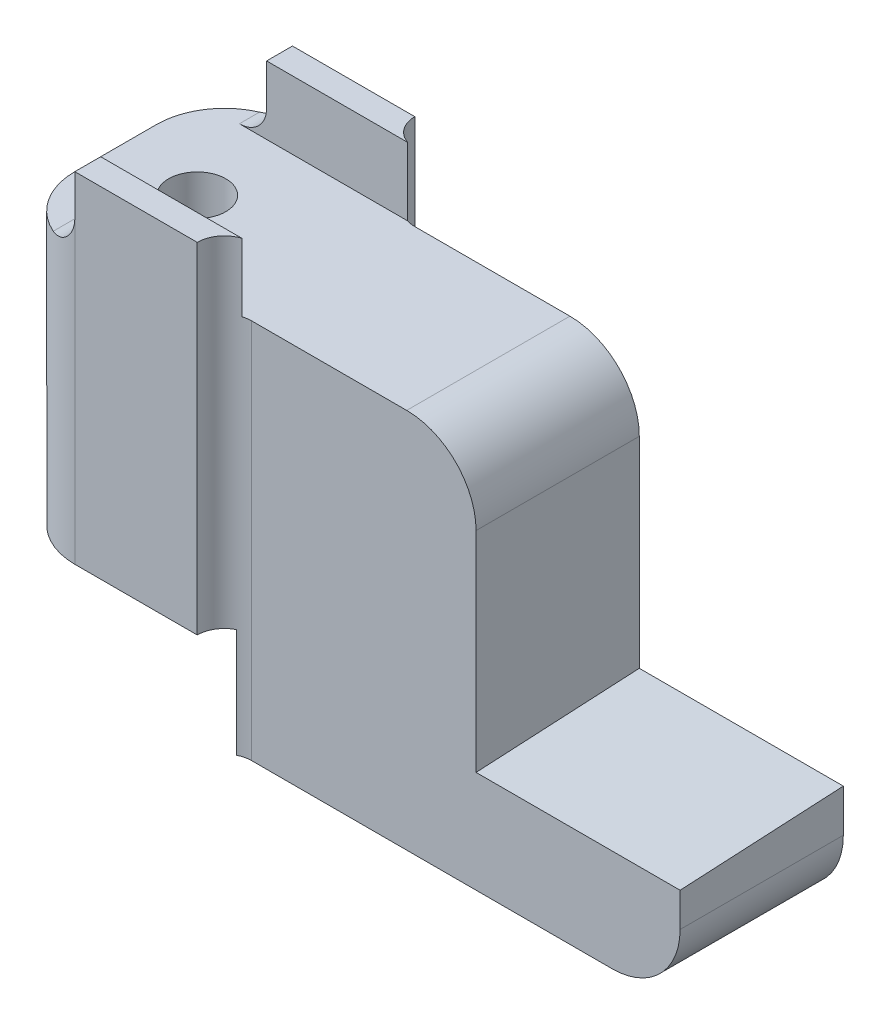
ISO-10303-21;
HEADER;
FILE_DESCRIPTION(('STEP AP214'),'2;1');
FILE_NAME('part.step','',(''),(''),'','','');
FILE_SCHEMA(('AUTOMOTIVE_DESIGN { 1 0 10303 214 1 1 1 1 }'));
ENDSEC;
DATA;
#1=APPLICATION_CONTEXT('core data for automotive mechanical design processes');
#2=APPLICATION_PROTOCOL_DEFINITION('international standard','automotive_design',2000,#1);
#3=PRODUCT_CONTEXT('',#1,'mechanical');
#4=PRODUCT('Part','Part','',(#3));
#5=PRODUCT_RELATED_PRODUCT_CATEGORY('part','',(#4));
#6=PRODUCT_DEFINITION_FORMATION('','',#4);
#7=PRODUCT_DEFINITION_CONTEXT('part definition',#1,'design');
#8=PRODUCT_DEFINITION('design','',#6,#7);
#9=PRODUCT_DEFINITION_SHAPE('','',#8);
#10=(LENGTH_UNIT() NAMED_UNIT(*) SI_UNIT(.MILLI.,.METRE.));
#11=(NAMED_UNIT(*) PLANE_ANGLE_UNIT() SI_UNIT($,.RADIAN.));
#12=(NAMED_UNIT(*) SI_UNIT($,.STERADIAN.) SOLID_ANGLE_UNIT());
#13=UNCERTAINTY_MEASURE_WITH_UNIT(LENGTH_MEASURE(1.E-05),#10,'distance_accuracy_value','');
#14=(GEOMETRIC_REPRESENTATION_CONTEXT(3) GLOBAL_UNCERTAINTY_ASSIGNED_CONTEXT((#13)) GLOBAL_UNIT_ASSIGNED_CONTEXT((#10,
#11,#12)) REPRESENTATION_CONTEXT('',''));
#15=CARTESIAN_POINT('',(0.,0.,0.));
#16=DIRECTION('',(0.,0.,1.));
#17=DIRECTION('',(1.,0.,0.));
#18=AXIS2_PLACEMENT_3D('',#15,#16,#17);
#19=CARTESIAN_POINT('',(26.5,20.,0.));
#20=DIRECTION('',(1.,0.,0.));
#21=DIRECTION('',(0.,0.,-1.));
#22=AXIS2_PLACEMENT_3D('',#19,#20,#21);
#23=PLANE('',#22);
#24=DIRECTION('',(0.,-1.,0.));
#25=VECTOR('',#24,1.);
#26=CARTESIAN_POINT('',(26.5,0.,5.99999999999999));
#27=LINE('',#26,#25);
#28=CARTESIAN_POINT('',(26.5,14.9,6.));
#29=VERTEX_POINT('',#28);
#30=CARTESIAN_POINT('',(26.5,-0.5,6.));
#31=VERTEX_POINT('',#30);
#32=EDGE_CURVE('E172',#29,#31,#27,.T.);
#33=ORIENTED_EDGE('',*,*,#32,.T.);
#34=DIRECTION('',(0.,-0.0523359562429444,0.998629534754574));
#35=VECTOR('',#34,1.);
#36=CARTESIAN_POINT('',(26.5,-0.5,6.));
#37=LINE('',#36,#35);
#38=CARTESIAN_POINT('',(26.5,0.1288933513965,-6.));
#39=VERTEX_POINT('',#38);
#40=EDGE_CURVE('E474',#39,#31,#37,.T.);
#41=ORIENTED_EDGE('',*,*,#40,.F.);
#42=DIRECTION('',(0.,1.,0.));
#43=VECTOR('',#42,1.);
#44=CARTESIAN_POINT('',(26.5,0.,-6.));
#45=LINE('',#44,#43);
#46=CARTESIAN_POINT('',(26.5,14.9,-6.));
#47=VERTEX_POINT('',#46);
#48=EDGE_CURVE('E182',#39,#47,#45,.T.);
#49=ORIENTED_EDGE('',*,*,#48,.T.);
#50=DIRECTION('',(0.,0.,1.));
#51=VECTOR('',#50,1.);
#52=CARTESIAN_POINT('',(26.5,14.9,0.));
#53=LINE('',#52,#51);
#54=EDGE_CURVE('E250',#47,#29,#53,.T.);
#55=ORIENTED_EDGE('',*,*,#54,.T.);
#56=EDGE_LOOP('',(#33,#41,#49,#55));
#57=FACE_BOUND('',#56,.T.);
#58=ADVANCED_FACE('F45',(#57),#23,.T.);
#59=CARTESIAN_POINT('',(0.,0.,0.));
#60=DIRECTION('',(0.,1.,0.));
#61=DIRECTION('',(0.,0.,1.));
#62=AXIS2_PLACEMENT_3D('',#59,#60,#61);
#63=PLANE('',#62);
#64=CARTESIAN_POINT('',(0.,0.,0.));
#65=DIRECTION('',(0.,1.,0.));
#66=DIRECTION('',(0.,0.,1.));
#67=AXIS2_PLACEMENT_3D('',#64,#65,#66);
#68=CIRCLE('',#67,2.1);
#69=CARTESIAN_POINT('',(0.,0.,2.1));
#70=VERTEX_POINT('',#69);
#71=EDGE_CURVE('E208',#70,#70,#68,.T.);
#72=ORIENTED_EDGE('',*,*,#71,.T.);
#73=EDGE_LOOP('',(#72));
#74=FACE_BOUND('',#73,.T.);
#75=DIRECTION('',(0.,0.,-1.));
#76=VECTOR('',#75,1.);
#77=CARTESIAN_POINT('',(9.1,0.,5.99999999999999));
#78=LINE('',#77,#76);
#79=CARTESIAN_POINT('',(9.1,0.,6.21394289005082));
#80=VERTEX_POINT('',#79);
#81=CARTESIAN_POINT('',(9.1,0.,-6.21394289005083));
#82=VERTEX_POINT('',#81);
#83=EDGE_CURVE('E108',#80,#82,#78,.T.);
#84=ORIENTED_EDGE('',*,*,#83,.F.);
#85=CARTESIAN_POINT('',(10.,0.,7.99999999999999));
#86=DIRECTION('',(0.,1.,0.));
#87=DIRECTION('',(0.,0.,1.));
#88=AXIS2_PLACEMENT_3D('',#85,#86,#87);
#89=CIRCLE('',#88,2.);
#90=CARTESIAN_POINT('',(8.,0.,8.));
#91=VERTEX_POINT('',#90);
#92=EDGE_CURVE('E114',#80,#91,#89,.T.);
#93=ORIENTED_EDGE('',*,*,#92,.T.);
#94=DIRECTION('',(1.,0.,0.));
#95=VECTOR('',#94,1.);
#96=CARTESIAN_POINT('',(0.,0.,8.));
#97=LINE('',#96,#95);
#98=CARTESIAN_POINT('',(-1.,0.,8.));
#99=VERTEX_POINT('',#98);
#100=EDGE_CURVE('E219',#99,#91,#97,.T.);
#101=ORIENTED_EDGE('',*,*,#100,.F.);
#102=CARTESIAN_POINT('',(-1.,0.,3.));
#103=DIRECTION('',(0.,1.,0.));
#104=DIRECTION('',(0.,0.,1.));
#105=AXIS2_PLACEMENT_3D('',#102,#103,#104);
#106=CIRCLE('',#105,5.);
#107=CARTESIAN_POINT('',(-6.,0.,3.));
#108=VERTEX_POINT('',#107);
#109=EDGE_CURVE('E234',#99,#108,#106,.F.);
#110=ORIENTED_EDGE('',*,*,#109,.T.);
#111=DIRECTION('',(0.,0.,1.));
#112=VECTOR('',#111,1.);
#113=CARTESIAN_POINT('',(-6.,0.,0.));
#114=LINE('',#113,#112);
#115=CARTESIAN_POINT('',(-6.,0.,-3.));
#116=VERTEX_POINT('',#115);
#117=EDGE_CURVE('E213',#116,#108,#114,.T.);
#118=ORIENTED_EDGE('',*,*,#117,.F.);
#119=CARTESIAN_POINT('',(-1.,0.,-3.));
#120=DIRECTION('',(0.,1.,0.));
#121=DIRECTION('',(0.,0.,1.));
#122=AXIS2_PLACEMENT_3D('',#119,#120,#121);
#123=CIRCLE('',#122,5.);
#124=CARTESIAN_POINT('',(-1.,0.,-8.));
#125=VERTEX_POINT('',#124);
#126=EDGE_CURVE('E237',#116,#125,#123,.F.);
#127=ORIENTED_EDGE('',*,*,#126,.T.);
#128=DIRECTION('',(1.,0.,0.));
#129=VECTOR('',#128,1.);
#130=CARTESIAN_POINT('',(0.,0.,-8.));
#131=LINE('',#130,#129);
#132=CARTESIAN_POINT('',(8.,0.,-8.));
#133=VERTEX_POINT('',#132);
#134=EDGE_CURVE('E221',#125,#133,#131,.T.);
#135=ORIENTED_EDGE('',*,*,#134,.T.);
#136=CARTESIAN_POINT('',(10.,0.,-8.));
#137=DIRECTION('',(0.,1.,0.));
#138=DIRECTION('',(0.,0.,1.));
#139=AXIS2_PLACEMENT_3D('',#136,#137,#138);
#140=CIRCLE('',#139,2.);
#141=EDGE_CURVE('E118',#133,#82,#140,.T.);
#142=ORIENTED_EDGE('',*,*,#141,.T.);
#143=EDGE_LOOP('',(#84,#93,#101,#110,#118,#127,#135,#142));
#144=FACE_BOUND('',#143,.T.);
#145=ADVANCED_FACE('F110',(#74,#144),#63,.F.);
#146=CARTESIAN_POINT('',(0.,20.,0.));
#147=DIRECTION('',(0.,1.,0.));
#148=DIRECTION('',(0.,0.,1.));
#149=AXIS2_PLACEMENT_3D('',#146,#147,#148);
#150=PLANE('',#149);
#151=CARTESIAN_POINT('',(0.,20.,0.));
#152=DIRECTION('',(0.,1.,0.));
#153=DIRECTION('',(0.,0.,1.));
#154=AXIS2_PLACEMENT_3D('',#151,#152,#153);
#155=CIRCLE('',#154,2.1);
#156=CARTESIAN_POINT('',(0.,20.,2.1));
#157=VERTEX_POINT('',#156);
#158=EDGE_CURVE('E209',#157,#157,#155,.T.);
#159=ORIENTED_EDGE('',*,*,#158,.F.);
#160=EDGE_LOOP('',(#159));
#161=FACE_BOUND('',#160,.T.);
#162=DIRECTION('',(1.,0.,0.));
#163=VECTOR('',#162,1.);
#164=CARTESIAN_POINT('',(8.,20.,-6.1));
#165=LINE('',#164,#163);
#166=CARTESIAN_POINT('',(-3.,20.,-6.1));
#167=VERTEX_POINT('',#166);
#168=CARTESIAN_POINT('',(9.3755002001599,20.,-6.1));
#169=VERTEX_POINT('',#168);
#170=EDGE_CURVE('E187',#167,#169,#165,.T.);
#171=ORIENTED_EDGE('',*,*,#170,.F.);
#172=DIRECTION('',(0.,0.,1.));
#173=VECTOR('',#172,1.);
#174=CARTESIAN_POINT('',(-3.,20.,0.));
#175=LINE('',#174,#173);
#176=CARTESIAN_POINT('',(-3.,20.,-7.58257569495584));
#177=VERTEX_POINT('',#176);
#178=EDGE_CURVE('E276',#167,#177,#175,.F.);
#179=ORIENTED_EDGE('',*,*,#178,.T.);
#180=CARTESIAN_POINT('',(-1.,20.,-3.));
#181=DIRECTION('',(0.,1.,0.));
#182=DIRECTION('',(0.,0.,1.));
#183=AXIS2_PLACEMENT_3D('',#180,#181,#182);
#184=CIRCLE('',#183,5.);
#185=CARTESIAN_POINT('',(-6.,20.,-3.));
#186=VERTEX_POINT('',#185);
#187=EDGE_CURVE('E244',#177,#186,#184,.T.);
#188=ORIENTED_EDGE('',*,*,#187,.T.);
#189=DIRECTION('',(0.,0.,1.));
#190=VECTOR('',#189,1.);
#191=CARTESIAN_POINT('',(-6.,20.,0.));
#192=LINE('',#191,#190);
#193=CARTESIAN_POINT('',(-6.,20.,3.));
#194=VERTEX_POINT('',#193);
#195=EDGE_CURVE('E212',#186,#194,#192,.T.);
#196=ORIENTED_EDGE('',*,*,#195,.T.);
#197=CARTESIAN_POINT('',(-1.,20.,3.));
#198=DIRECTION('',(0.,1.,0.));
#199=DIRECTION('',(0.,0.,1.));
#200=AXIS2_PLACEMENT_3D('',#197,#198,#199);
#201=CIRCLE('',#200,5.);
#202=CARTESIAN_POINT('',(-3.,20.,7.58257569495584));
#203=VERTEX_POINT('',#202);
#204=EDGE_CURVE('E241',#194,#203,#201,.T.);
#205=ORIENTED_EDGE('',*,*,#204,.T.);
#206=DIRECTION('',(0.,0.,1.));
#207=VECTOR('',#206,1.);
#208=CARTESIAN_POINT('',(-2.99999999999999,20.,0.));
#209=LINE('',#208,#207);
#210=CARTESIAN_POINT('',(-3.,20.,6.1));
#211=VERTEX_POINT('',#210);
#212=EDGE_CURVE('E274',#203,#211,#209,.F.);
#213=ORIENTED_EDGE('',*,*,#212,.T.);
#214=DIRECTION('',(-1.,0.,0.));
#215=VECTOR('',#214,1.);
#216=CARTESIAN_POINT('',(8.,20.,6.1));
#217=LINE('',#216,#215);
#218=CARTESIAN_POINT('',(9.3755002001599,20.,6.1));
#219=VERTEX_POINT('',#218);
#220=EDGE_CURVE('E61',#219,#211,#217,.T.);
#221=ORIENTED_EDGE('',*,*,#220,.F.);
#222=CARTESIAN_POINT('',(10.,20.,8.));
#223=DIRECTION('',(0.,1.,0.));
#224=DIRECTION('',(0.,0.,1.));
#225=AXIS2_PLACEMENT_3D('',#222,#223,#224);
#226=CIRCLE('',#225,2.);
#227=CARTESIAN_POINT('',(10.,20.,6.));
#228=VERTEX_POINT('',#227);
#229=EDGE_CURVE('E12',#219,#228,#226,.F.);
#230=ORIENTED_EDGE('',*,*,#229,.T.);
#231=DIRECTION('',(-1.,0.,0.));
#232=VECTOR('',#231,1.);
#233=CARTESIAN_POINT('',(82.3238075793812,20.,5.99999999999999));
#234=LINE('',#233,#232);
#235=CARTESIAN_POINT('',(21.4,20.,6.));
#236=VERTEX_POINT('',#235);
#237=EDGE_CURVE('E155',#236,#228,#234,.T.);
#238=ORIENTED_EDGE('',*,*,#237,.F.);
#239=DIRECTION('',(0.,0.,1.));
#240=VECTOR('',#239,1.);
#241=CARTESIAN_POINT('',(21.4,20.,0.));
#242=LINE('',#241,#240);
#243=CARTESIAN_POINT('',(21.4,20.,-6.));
#244=VERTEX_POINT('',#243);
#245=EDGE_CURVE('E254',#236,#244,#242,.F.);
#246=ORIENTED_EDGE('',*,*,#245,.T.);
#247=DIRECTION('',(-1.,0.,0.));
#248=VECTOR('',#247,1.);
#249=CARTESIAN_POINT('',(82.3238075793812,20.,-6.00000000000002));
#250=LINE('',#249,#248);
#251=CARTESIAN_POINT('',(10.,20.,-6.));
#252=VERTEX_POINT('',#251);
#253=EDGE_CURVE('E168',#244,#252,#250,.T.);
#254=ORIENTED_EDGE('',*,*,#253,.T.);
#255=CARTESIAN_POINT('',(10.,20.,-8.));
#256=DIRECTION('',(0.,1.,0.));
#257=DIRECTION('',(0.,0.,1.));
#258=AXIS2_PLACEMENT_3D('',#255,#256,#257);
#259=CIRCLE('',#258,2.);
#260=EDGE_CURVE('E502',#252,#169,#259,.F.);
#261=ORIENTED_EDGE('',*,*,#260,.T.);
#262=EDGE_LOOP('',(#171,#179,#188,#196,#205,#213,#221,#230,#238,#246,#254,#261));
#263=FACE_BOUND('',#262,.T.);
#264=ADVANCED_FACE('F152',(#161,#263),#150,.T.);
#265=CARTESIAN_POINT('',(0.,20.,8.));
#266=DIRECTION('',(0.,0.,-1.));
#267=DIRECTION('',(-1.,0.,0.));
#268=AXIS2_PLACEMENT_3D('',#265,#266,#267);
#269=PLANE('',#268);
#270=DIRECTION('',(0.,-1.,0.));
#271=VECTOR('',#270,1.);
#272=CARTESIAN_POINT('',(8.,20.,8.));
#273=LINE('',#272,#271);
#274=CARTESIAN_POINT('',(8.,25.,8.));
#275=VERTEX_POINT('',#274);
#276=EDGE_CURVE('E132',#275,#91,#273,.T.);
#277=ORIENTED_EDGE('',*,*,#276,.F.);
#278=DIRECTION('',(1.,0.,0.));
#279=VECTOR('',#278,1.);
#280=CARTESIAN_POINT('',(8.,25.,8.));
#281=LINE('',#280,#279);
#282=CARTESIAN_POINT('',(-1.,25.,8.));
#283=VERTEX_POINT('',#282);
#284=EDGE_CURVE('E188',#283,#275,#281,.T.);
#285=ORIENTED_EDGE('',*,*,#284,.F.);
#286=DIRECTION('',(0.,-1.,0.));
#287=VECTOR('',#286,1.);
#288=CARTESIAN_POINT('',(-1.,25.,8.));
#289=LINE('',#288,#287);
#290=CARTESIAN_POINT('',(-1.,22.,8.));
#291=VERTEX_POINT('',#290);
#292=EDGE_CURVE('E181',#283,#291,#289,.T.);
#293=ORIENTED_EDGE('',*,*,#292,.T.);
#294=DIRECTION('',(0.,-1.,0.));
#295=VECTOR('',#294,1.);
#296=CARTESIAN_POINT('',(-1.,20.,8.));
#297=LINE('',#296,#295);
#298=EDGE_CURVE('E247',#291,#99,#297,.T.);
#299=ORIENTED_EDGE('',*,*,#298,.T.);
#300=ORIENTED_EDGE('',*,*,#100,.T.);
#301=EDGE_LOOP('',(#277,#285,#293,#299,#300));
#302=FACE_BOUND('',#301,.T.);
#303=ADVANCED_FACE('F375',(#302),#269,.F.);
#304=CARTESIAN_POINT('',(0.,20.,-8.));
#305=DIRECTION('',(0.,0.,-1.));
#306=DIRECTION('',(-1.,0.,0.));
#307=AXIS2_PLACEMENT_3D('',#304,#305,#306);
#308=PLANE('',#307);
#309=ORIENTED_EDGE('',*,*,#134,.F.);
#310=DIRECTION('',(0.,-1.,0.));
#311=VECTOR('',#310,1.);
#312=CARTESIAN_POINT('',(-1.,20.,-8.));
#313=LINE('',#312,#311);
#314=CARTESIAN_POINT('',(-1.,22.,-8.));
#315=VERTEX_POINT('',#314);
#316=EDGE_CURVE('E75',#125,#315,#313,.F.);
#317=ORIENTED_EDGE('',*,*,#316,.T.);
#318=DIRECTION('',(0.,-1.,0.));
#319=VECTOR('',#318,1.);
#320=CARTESIAN_POINT('',(-1.,25.,-8.));
#321=LINE('',#320,#319);
#322=CARTESIAN_POINT('',(-1.,25.,-8.));
#323=VERTEX_POINT('',#322);
#324=EDGE_CURVE('E206',#323,#315,#321,.T.);
#325=ORIENTED_EDGE('',*,*,#324,.F.);
#326=DIRECTION('',(-1.,0.,0.));
#327=VECTOR('',#326,1.);
#328=CARTESIAN_POINT('',(8.,25.,-8.));
#329=LINE('',#328,#327);
#330=CARTESIAN_POINT('',(8.,25.,-8.));
#331=VERTEX_POINT('',#330);
#332=EDGE_CURVE('E194',#331,#323,#329,.T.);
#333=ORIENTED_EDGE('',*,*,#332,.F.);
#334=DIRECTION('',(0.,-1.,0.));
#335=VECTOR('',#334,1.);
#336=CARTESIAN_POINT('',(8.,20.,-8.));
#337=LINE('',#336,#335);
#338=EDGE_CURVE('E216',#331,#133,#337,.T.);
#339=ORIENTED_EDGE('',*,*,#338,.T.);
#340=EDGE_LOOP('',(#309,#317,#325,#333,#339));
#341=FACE_BOUND('',#340,.T.);
#342=ADVANCED_FACE('F381',(#341),#308,.T.);
#343=CARTESIAN_POINT('',(0.,20.,0.));
#344=DIRECTION('',(0.,-1.,0.));
#345=DIRECTION('',(0.,0.,-1.));
#346=AXIS2_PLACEMENT_3D('',#343,#344,#345);
#347=CYLINDRICAL_SURFACE('',#346,2.1);
#348=ORIENTED_EDGE('',*,*,#158,.T.);
#349=EDGE_LOOP('',(#348));
#350=FACE_BOUND('',#349,.T.);
#351=ORIENTED_EDGE('',*,*,#71,.F.);
#352=EDGE_LOOP('',(#351));
#353=FACE_BOUND('',#352,.T.);
#354=ADVANCED_FACE('F316',(#350,#353),#347,.F.);
#355=CARTESIAN_POINT('',(-6.,20.,0.));
#356=DIRECTION('',(1.,0.,0.));
#357=DIRECTION('',(0.,0.,-1.));
#358=AXIS2_PLACEMENT_3D('',#355,#356,#357);
#359=PLANE('',#358);
#360=ORIENTED_EDGE('',*,*,#195,.F.);
#361=DIRECTION('',(0.,-1.,0.));
#362=VECTOR('',#361,1.);
#363=CARTESIAN_POINT('',(-6.,0.,-3.));
#364=LINE('',#363,#362);
#365=EDGE_CURVE('E231',#186,#116,#364,.T.);
#366=ORIENTED_EDGE('',*,*,#365,.T.);
#367=ORIENTED_EDGE('',*,*,#117,.T.);
#368=DIRECTION('',(0.,-1.,0.));
#369=VECTOR('',#368,1.);
#370=CARTESIAN_POINT('',(-6.,20.,3.));
#371=LINE('',#370,#369);
#372=EDGE_CURVE('E228',#108,#194,#371,.F.);
#373=ORIENTED_EDGE('',*,*,#372,.T.);
#374=EDGE_LOOP('',(#360,#366,#367,#373));
#375=FACE_BOUND('',#374,.T.);
#376=ADVANCED_FACE('F314',(#375),#359,.F.);
#377=CARTESIAN_POINT('',(-1.,20.,-3.));
#378=DIRECTION('',(0.,1.,0.));
#379=DIRECTION('',(0.,0.,1.));
#380=AXIS2_PLACEMENT_3D('',#377,#378,#379);
#381=CYLINDRICAL_SURFACE('',#380,5.);
#382=ORIENTED_EDGE('',*,*,#187,.F.);
#383=CARTESIAN_POINT('',(-3.,20.,-7.58257569495584));
#384=CARTESIAN_POINT('',(-2.94882422969423,19.9999944328901,-7.60491893613169));
#385=CARTESIAN_POINT('',(-2.89725932038594,20.0019645357416,-7.62639486475811));
#386=CARTESIAN_POINT('',(-2.79369744624647,20.0099917987297,-7.66751917245971));
#387=CARTESIAN_POINT('',(-2.74170031103067,20.0160506542607,-7.68716678958158));
#388=CARTESIAN_POINT('',(-2.63763614443466,20.0323956305357,-7.72453258534548));
#389=CARTESIAN_POINT('',(-2.58556909074132,20.04268395511,-7.74224975199872));
#390=CARTESIAN_POINT('',(-2.48184232631921,20.0675501736024,-7.77568002270725));
#391=CARTESIAN_POINT('',(-2.43018255226676,20.0821273866197,-7.79139344430844));
#392=CARTESIAN_POINT('',(-2.27615957807409,20.1324602456837,-7.83557512853718));
#393=CARTESIAN_POINT('',(-2.17496470618029,20.1747848693521,-7.86100962684806));
#394=CARTESIAN_POINT('',(-1.97979313568709,20.2762601637192,-7.90408220940223));
#395=CARTESIAN_POINT('',(-1.88580912608439,20.3353934981539,-7.92172827889794));
#396=CARTESIAN_POINT('',(-1.71183330631352,20.4663730533753,-7.94982429535056));
#397=CARTESIAN_POINT('',(-1.63143641191401,20.5376274109362,-7.96053010212969));
#398=CARTESIAN_POINT('',(-1.4828499126527,20.6924165262334,-7.97719428554441));
#399=CARTESIAN_POINT('',(-1.41466630203297,20.7759572776653,-7.98315033593752));
#400=CARTESIAN_POINT('',(-1.29171941866968,20.9542173617868,-7.99186947445244));
#401=CARTESIAN_POINT('',(-1.23715108357621,21.0490731605746,-7.99458807842981));
#402=CARTESIAN_POINT('',(-1.14419740242342,21.2464148211055,-7.99813794238579));
#403=CARTESIAN_POINT('',(-1.10580879749256,21.3488991414377,-7.99896958257891));
#404=CARTESIAN_POINT('',(-1.05083168209967,21.5425568945564,-7.99980466293805));
#405=CARTESIAN_POINT('',(-1.03179497424371,21.6330388257732,-7.99991600343519));
#406=CARTESIAN_POINT('',(-1.01273310942155,21.7700028148672,-7.99998735068458));
#407=CARTESIAN_POINT('',(-1.00796135411201,21.8158640735284,-7.99999518940273));
#408=CARTESIAN_POINT('',(-1.00159438841257,21.9078125147172,-8.00000024496916));
#409=CARTESIAN_POINT('',(-0.999999587452212,21.9538997255972,-7.99999746044851));
#410=CARTESIAN_POINT('',(-1.,22.,-8.));
#411=B_SPLINE_CURVE_WITH_KNOTS('',3,(#383,#384,#385,#386,#387,#388,#389,#390,#391,#392,#393,
#394,#395,#396,#397,#398,#399,#400,#401,#402,#403,#404,#405,#406,#407,#408,#409,#410),
.UNSPECIFIED.,.F.,.F.,(4,2,2,2,2,2,2,2,2,2,2,2,2,4),(0.,0.167492523155857,0.335054539512393,
0.502703977545899,0.670326814028303,1.00624515695024,1.34181828783692,1.66418569312858,
1.98671088440653,2.31361840235486,2.64046004409222,2.91692195256549,3.05515140156105,
3.19339866370467),.UNSPECIFIED.);
#412=EDGE_CURVE('E289',#177,#315,#411,.T.);
#413=ORIENTED_EDGE('',*,*,#412,.T.);
#414=ORIENTED_EDGE('',*,*,#316,.F.);
#415=ORIENTED_EDGE('',*,*,#126,.F.);
#416=ORIENTED_EDGE('',*,*,#365,.F.);
#417=EDGE_LOOP('',(#382,#413,#414,#415,#416));
#418=FACE_BOUND('',#417,.T.);
#419=ADVANCED_FACE('F309',(#418),#381,.T.);
#420=CARTESIAN_POINT('',(-1.,20.,3.));
#421=DIRECTION('',(0.,-1.,0.));
#422=DIRECTION('',(0.,0.,-1.));
#423=AXIS2_PLACEMENT_3D('',#420,#421,#422);
#424=CYLINDRICAL_SURFACE('',#423,5.);
#425=ORIENTED_EDGE('',*,*,#204,.F.);
#426=ORIENTED_EDGE('',*,*,#372,.F.);
#427=ORIENTED_EDGE('',*,*,#109,.F.);
#428=ORIENTED_EDGE('',*,*,#298,.F.);
#429=CARTESIAN_POINT('',(-1.,22.,8.));
#430=CARTESIAN_POINT('',(-1.00000038549266,21.9438197541548,7.99999456414493));
#431=CARTESIAN_POINT('',(-1.00236864900355,21.8876663972967,8.00000061230362));
#432=CARTESIAN_POINT('',(-1.01181673847198,21.7757598748005,7.99998932672866));
#433=CARTESIAN_POINT('',(-1.01889637009736,21.720006692752,7.99997199395938));
#434=CARTESIAN_POINT('',(-1.0471406188201,21.5540110913333,7.99981555111103));
#435=CARTESIAN_POINT('',(-1.07531073970212,21.4448774971545,7.99957223424861));
#436=CARTESIAN_POINT('',(-1.14955124400368,21.2328770712525,7.99789929959921));
#437=CARTESIAN_POINT('',(-1.19563178406897,21.1300138336818,7.99646900817901));
#438=CARTESIAN_POINT('',(-1.30435718615598,20.9335144275432,7.99102372189666));
#439=CARTESIAN_POINT('',(-1.36699938502222,20.839876778798,7.9870091424456));
#440=CARTESIAN_POINT('',(-1.50647304039909,20.6651631277837,7.97477013350808));
#441=CARTESIAN_POINT('',(-1.58320785105938,20.5840080953729,7.9665737399993));
#442=CARTESIAN_POINT('',(-1.74860056990878,20.43593255847,7.94434379333329));
#443=CARTESIAN_POINT('',(-1.83725310106599,20.3690056694805,7.93031286665657));
#444=CARTESIAN_POINT('',(-2.02085075275591,20.252786313052,7.89554368797716));
#445=CARTESIAN_POINT('',(-2.11556316287539,20.2030688102354,7.87499553674227));
#446=CARTESIAN_POINT('',(-2.31007399857496,20.1197880524475,7.82635923189559));
#447=CARTESIAN_POINT('',(-2.40987477844155,20.0862323516169,7.7982675619256));
#448=CARTESIAN_POINT('',(-2.59213696859382,20.0402167218544,7.74051188293385));
#449=CARTESIAN_POINT('',(-2.67432048017418,20.0249724563857,7.71214255413355));
#450=CARTESIAN_POINT('',(-2.79709127754244,20.0098925660219,7.66608785901438));
#451=CARTESIAN_POINT('',(-2.83790170771629,20.0061635773717,7.65016551568938));
#452=CARTESIAN_POINT('',(-2.91921721963935,20.0012171338854,7.6171996635397));
#453=CARTESIAN_POINT('',(-2.95972232929329,19.9999994466869,7.60015625859373));
#454=CARTESIAN_POINT('',(-3.,20.,7.58257569495584));
#455=B_SPLINE_CURVE_WITH_KNOTS('',3,(#429,#430,#431,#432,#433,#434,#435,#436,#437,#438,#439,
#440,#441,#442,#443,#444,#445,#446,#447,#448,#449,#450,#451,#452,#453,#454),.UNSPECIFIED.,.F.,
.F.,(4,2,2,2,2,2,2,2,2,2,2,2,4),(0.,0.168437420635298,0.33686789407931,0.673269387204793,
1.00986192597299,1.346400372718,1.68071165855397,2.01487261305517,2.34006609941677,
2.66541143636622,2.9294255911562,3.06124371233518,3.19304963627351),.UNSPECIFIED.);
#456=EDGE_CURVE('E298',#291,#203,#455,.T.);
#457=ORIENTED_EDGE('',*,*,#456,.T.);
#458=EDGE_LOOP('',(#425,#426,#427,#428,#457));
#459=FACE_BOUND('',#458,.T.);
#460=ADVANCED_FACE('F313',(#459),#424,.T.);
#461=CARTESIAN_POINT('',(-1.,25.,-8.));
#462=DIRECTION('',(1.,0.,0.));
#463=DIRECTION('',(0.,0.,-1.));
#464=AXIS2_PLACEMENT_3D('',#461,#462,#463);
#465=PLANE('',#464);
#466=ORIENTED_EDGE('',*,*,#324,.T.);
#467=DIRECTION('',(0.,0.,1.));
#468=VECTOR('',#467,1.);
#469=CARTESIAN_POINT('',(-1.,22.,-8.));
#470=LINE('',#469,#468);
#471=CARTESIAN_POINT('',(-1.,22.,-6.1));
#472=VERTEX_POINT('',#471);
#473=EDGE_CURVE('E271',#315,#472,#470,.T.);
#474=ORIENTED_EDGE('',*,*,#473,.T.);
#475=DIRECTION('',(0.,-1.,0.));
#476=VECTOR('',#475,1.);
#477=CARTESIAN_POINT('',(-1.,25.,-6.1));
#478=LINE('',#477,#476);
#479=CARTESIAN_POINT('',(-1.,25.,-6.1));
#480=VERTEX_POINT('',#479);
#481=EDGE_CURVE('E202',#480,#472,#478,.T.);
#482=ORIENTED_EDGE('',*,*,#481,.F.);
#483=DIRECTION('',(0.,0.,1.));
#484=VECTOR('',#483,1.);
#485=CARTESIAN_POINT('',(-1.,25.,-8.));
#486=LINE('',#485,#484);
#487=EDGE_CURVE('E197',#323,#480,#486,.T.);
#488=ORIENTED_EDGE('',*,*,#487,.F.);
#489=EDGE_LOOP('',(#466,#474,#482,#488));
#490=FACE_BOUND('',#489,.T.);
#491=ADVANCED_FACE('F321',(#490),#465,.F.);
#492=CARTESIAN_POINT('',(8.,25.,-6.1));
#493=DIRECTION('',(0.,0.,-1.));
#494=DIRECTION('',(-1.,0.,0.));
#495=AXIS2_PLACEMENT_3D('',#492,#493,#494);
#496=PLANE('',#495);
#497=ORIENTED_EDGE('',*,*,#170,.T.);
#498=DIRECTION('',(0.,1.,0.));
#499=VECTOR('',#498,1.);
#500=CARTESIAN_POINT('',(9.3755002001599,20.,-6.1));
#501=LINE('',#500,#499);
#502=CARTESIAN_POINT('',(9.3755002001599,25.,-6.1));
#503=VERTEX_POINT('',#502);
#504=EDGE_CURVE('E505',#169,#503,#501,.T.);
#505=ORIENTED_EDGE('',*,*,#504,.T.);
#506=DIRECTION('',(1.,0.,0.));
#507=VECTOR('',#506,1.);
#508=CARTESIAN_POINT('',(8.,25.,-6.1));
#509=LINE('',#508,#507);
#510=EDGE_CURVE('E200',#480,#503,#509,.T.);
#511=ORIENTED_EDGE('',*,*,#510,.F.);
#512=ORIENTED_EDGE('',*,*,#481,.T.);
#513=CARTESIAN_POINT('',(-3.,22.,-6.1));
#514=DIRECTION('',(0.,0.,-1.));
#515=DIRECTION('',(-1.,0.,0.));
#516=AXIS2_PLACEMENT_3D('',#513,#514,#515);
#517=CIRCLE('',#516,2.);
#518=EDGE_CURVE('E286',#472,#167,#517,.T.);
#519=ORIENTED_EDGE('',*,*,#518,.T.);
#520=EDGE_LOOP('',(#497,#505,#511,#512,#519));
#521=FACE_BOUND('',#520,.T.);
#522=ADVANCED_FACE('F366',(#521),#496,.F.);
#523=CARTESIAN_POINT('',(0.,25.,0.));
#524=DIRECTION('',(0.,-1.,0.));
#525=DIRECTION('',(0.,0.,-1.));
#526=AXIS2_PLACEMENT_3D('',#523,#524,#525);
#527=PLANE('',#526);
#528=ORIENTED_EDGE('',*,*,#510,.T.);
#529=CARTESIAN_POINT('',(10.,25.,-8.));
#530=DIRECTION('',(0.,-1.,0.));
#531=DIRECTION('',(0.,0.,-1.));
#532=AXIS2_PLACEMENT_3D('',#529,#530,#531);
#533=CIRCLE('',#532,2.);
#534=EDGE_CURVE('E508',#503,#331,#533,.T.);
#535=ORIENTED_EDGE('',*,*,#534,.T.);
#536=ORIENTED_EDGE('',*,*,#332,.T.);
#537=ORIENTED_EDGE('',*,*,#487,.T.);
#538=EDGE_LOOP('',(#528,#535,#536,#537));
#539=FACE_BOUND('',#538,.T.);
#540=ADVANCED_FACE('F356',(#539),#527,.F.);
#541=CARTESIAN_POINT('',(8.,25.,6.1));
#542=DIRECTION('',(0.,0.,1.));
#543=DIRECTION('',(1.,0.,0.));
#544=AXIS2_PLACEMENT_3D('',#541,#542,#543);
#545=PLANE('',#544);
#546=ORIENTED_EDGE('',*,*,#220,.T.);
#547=CARTESIAN_POINT('',(-3.,22.,6.1));
#548=DIRECTION('',(0.,0.,1.));
#549=DIRECTION('',(1.,0.,0.));
#550=AXIS2_PLACEMENT_3D('',#547,#548,#549);
#551=CIRCLE('',#550,2.);
#552=CARTESIAN_POINT('',(-0.999999999999999,22.,6.1));
#553=VERTEX_POINT('',#552);
#554=EDGE_CURVE('E506',#211,#553,#551,.T.);
#555=ORIENTED_EDGE('',*,*,#554,.T.);
#556=DIRECTION('',(0.,-1.,0.));
#557=VECTOR('',#556,1.);
#558=CARTESIAN_POINT('',(-0.999999999999999,25.,6.1));
#559=LINE('',#558,#557);
#560=CARTESIAN_POINT('',(-0.999999999999999,25.,6.1));
#561=VERTEX_POINT('',#560);
#562=EDGE_CURVE('E178',#561,#553,#559,.T.);
#563=ORIENTED_EDGE('',*,*,#562,.F.);
#564=DIRECTION('',(-1.,0.,0.));
#565=VECTOR('',#564,1.);
#566=CARTESIAN_POINT('',(8.,25.,6.1));
#567=LINE('',#566,#565);
#568=CARTESIAN_POINT('',(9.37550020015991,25.,6.1));
#569=VERTEX_POINT('',#568);
#570=EDGE_CURVE('E146',#569,#561,#567,.T.);
#571=ORIENTED_EDGE('',*,*,#570,.F.);
#572=DIRECTION('',(0.,-1.,0.));
#573=VECTOR('',#572,1.);
#574=CARTESIAN_POINT('',(9.37550020015991,25.,6.1));
#575=LINE('',#574,#573);
#576=EDGE_CURVE('E54',#569,#219,#575,.T.);
#577=ORIENTED_EDGE('',*,*,#576,.T.);
#578=EDGE_LOOP('',(#546,#555,#563,#571,#577));
#579=FACE_BOUND('',#578,.T.);
#580=ADVANCED_FACE('F141',(#579),#545,.F.);
#581=CARTESIAN_POINT('',(-1.,25.,8.));
#582=DIRECTION('',(1.,0.,0.));
#583=DIRECTION('',(0.,0.,-1.));
#584=AXIS2_PLACEMENT_3D('',#581,#582,#583);
#585=PLANE('',#584);
#586=ORIENTED_EDGE('',*,*,#562,.T.);
#587=DIRECTION('',(0.,0.,1.));
#588=VECTOR('',#587,1.);
#589=CARTESIAN_POINT('',(-1.,22.,8.));
#590=LINE('',#589,#588);
#591=EDGE_CURVE('E279',#553,#291,#590,.T.);
#592=ORIENTED_EDGE('',*,*,#591,.T.);
#593=ORIENTED_EDGE('',*,*,#292,.F.);
#594=DIRECTION('',(0.,0.,1.));
#595=VECTOR('',#594,1.);
#596=CARTESIAN_POINT('',(-1.,25.,8.));
#597=LINE('',#596,#595);
#598=EDGE_CURVE('E185',#561,#283,#597,.T.);
#599=ORIENTED_EDGE('',*,*,#598,.F.);
#600=EDGE_LOOP('',(#586,#592,#593,#599));
#601=FACE_BOUND('',#600,.T.);
#602=ADVANCED_FACE('F355',(#601),#585,.F.);
#603=CARTESIAN_POINT('',(0.,25.,0.));
#604=DIRECTION('',(0.,-1.,0.));
#605=DIRECTION('',(0.,0.,-1.));
#606=AXIS2_PLACEMENT_3D('',#603,#604,#605);
#607=PLANE('',#606);
#608=ORIENTED_EDGE('',*,*,#284,.T.);
#609=CARTESIAN_POINT('',(10.,25.,8.));
#610=DIRECTION('',(0.,-1.,0.));
#611=DIRECTION('',(0.,0.,-1.));
#612=AXIS2_PLACEMENT_3D('',#609,#610,#611);
#613=CIRCLE('',#612,2.);
#614=EDGE_CURVE('E133',#275,#569,#613,.T.);
#615=ORIENTED_EDGE('',*,*,#614,.T.);
#616=ORIENTED_EDGE('',*,*,#570,.T.);
#617=ORIENTED_EDGE('',*,*,#598,.T.);
#618=EDGE_LOOP('',(#608,#615,#616,#617));
#619=FACE_BOUND('',#618,.T.);
#620=ADVANCED_FACE('F359',(#619),#607,.F.);
#621=CARTESIAN_POINT('',(82.3238075793812,0.,5.99999999999998));
#622=DIRECTION('',(0.,0.,-1.));
#623=DIRECTION('',(0.,1.,0.));
#624=AXIS2_PLACEMENT_3D('',#621,#622,#623);
#625=PLANE('',#624);
#626=ORIENTED_EDGE('',*,*,#237,.T.);
#627=DIRECTION('',(0.,-1.,0.));
#628=VECTOR('',#627,1.);
#629=CARTESIAN_POINT('',(10.,0.,6.));
#630=LINE('',#629,#628);
#631=CARTESIAN_POINT('',(10.,-8.,5.99999999999999));
#632=VERTEX_POINT('',#631);
#633=EDGE_CURVE('E148',#228,#632,#630,.T.);
#634=ORIENTED_EDGE('',*,*,#633,.T.);
#635=DIRECTION('',(-1.,0.,0.));
#636=VECTOR('',#635,1.);
#637=CARTESIAN_POINT('',(9.1,-8.,5.99999999999999));
#638=LINE('',#637,#636);
#639=CARTESIAN_POINT('',(36.5,-8.,5.99999999999999));
#640=VERTEX_POINT('',#639);
#641=EDGE_CURVE('E122',#640,#632,#638,.T.);
#642=ORIENTED_EDGE('',*,*,#641,.F.);
#643=CARTESIAN_POINT('',(36.5,-3.,5.99999999999999));
#644=DIRECTION('',(0.,0.,-1.));
#645=DIRECTION('',(0.,1.,0.));
#646=AXIS2_PLACEMENT_3D('',#643,#644,#645);
#647=CIRCLE('',#646,5.);
#648=CARTESIAN_POINT('',(41.5,-3.,6.));
#649=VERTEX_POINT('',#648);
#650=EDGE_CURVE('E268',#640,#649,#647,.F.);
#651=ORIENTED_EDGE('',*,*,#650,.T.);
#652=DIRECTION('',(0.,-1.,0.));
#653=VECTOR('',#652,1.);
#654=CARTESIAN_POINT('',(41.5,-8.,6.));
#655=LINE('',#654,#653);
#656=CARTESIAN_POINT('',(41.5,-0.5,6.));
#657=VERTEX_POINT('',#656);
#658=EDGE_CURVE('E484',#657,#649,#655,.T.);
#659=ORIENTED_EDGE('',*,*,#658,.F.);
#660=DIRECTION('',(-1.,0.,0.));
#661=VECTOR('',#660,1.);
#662=CARTESIAN_POINT('',(41.5,-0.5,6.));
#663=LINE('',#662,#661);
#664=EDGE_CURVE('E480',#657,#31,#663,.T.);
#665=ORIENTED_EDGE('',*,*,#664,.T.);
#666=ORIENTED_EDGE('',*,*,#32,.F.);
#667=CARTESIAN_POINT('',(21.4,14.9,6.));
#668=DIRECTION('',(0.,0.,-1.));
#669=DIRECTION('',(0.,1.,0.));
#670=AXIS2_PLACEMENT_3D('',#667,#668,#669);
#671=CIRCLE('',#670,5.1);
#672=EDGE_CURVE('E167',#29,#236,#671,.F.);
#673=ORIENTED_EDGE('',*,*,#672,.T.);
#674=EDGE_LOOP('',(#626,#634,#642,#651,#659,#665,#666,#673));
#675=FACE_BOUND('',#674,.T.);
#676=ADVANCED_FACE('F162',(#675),#625,.F.);
#677=CARTESIAN_POINT('',(82.3238075793812,0.,-6.00000000000002));
#678=DIRECTION('',(0.,0.,1.));
#679=DIRECTION('',(1.,0.,0.));
#680=AXIS2_PLACEMENT_3D('',#677,#678,#679);
#681=PLANE('',#680);
#682=DIRECTION('',(1.,0.,0.));
#683=VECTOR('',#682,1.);
#684=CARTESIAN_POINT('',(9.1,-8.,-5.99999999999999));
#685=LINE('',#684,#683);
#686=CARTESIAN_POINT('',(10.,-8.,-5.99999999999999));
#687=VERTEX_POINT('',#686);
#688=CARTESIAN_POINT('',(36.5,-8.,-5.99999999999999));
#689=VERTEX_POINT('',#688);
#690=EDGE_CURVE('E169',#687,#689,#685,.T.);
#691=ORIENTED_EDGE('',*,*,#690,.F.);
#692=DIRECTION('',(0.,1.,0.));
#693=VECTOR('',#692,1.);
#694=CARTESIAN_POINT('',(10.,0.,-6.));
#695=LINE('',#694,#693);
#696=EDGE_CURVE('E282',#687,#252,#695,.T.);
#697=ORIENTED_EDGE('',*,*,#696,.T.);
#698=ORIENTED_EDGE('',*,*,#253,.F.);
#699=CARTESIAN_POINT('',(21.4,14.9,-6.));
#700=DIRECTION('',(0.,0.,1.));
#701=DIRECTION('',(1.,0.,0.));
#702=AXIS2_PLACEMENT_3D('',#699,#700,#701);
#703=CIRCLE('',#702,5.1);
#704=EDGE_CURVE('E256',#244,#47,#703,.F.);
#705=ORIENTED_EDGE('',*,*,#704,.T.);
#706=ORIENTED_EDGE('',*,*,#48,.F.);
#707=DIRECTION('',(-1.,0.,0.));
#708=VECTOR('',#707,1.);
#709=CARTESIAN_POINT('',(41.5,0.1288933513965,-5.99999999999999));
#710=LINE('',#709,#708);
#711=CARTESIAN_POINT('',(41.5,0.1288933513965,-5.99999999999999));
#712=VERTEX_POINT('',#711);
#713=EDGE_CURVE('E123',#712,#39,#710,.T.);
#714=ORIENTED_EDGE('',*,*,#713,.F.);
#715=DIRECTION('',(0.,1.,0.));
#716=VECTOR('',#715,1.);
#717=CARTESIAN_POINT('',(41.5,0.1288933513965,-5.99999999999999));
#718=LINE('',#717,#716);
#719=CARTESIAN_POINT('',(41.5,-3.,-5.99999999999999));
#720=VERTEX_POINT('',#719);
#721=EDGE_CURVE('E466',#720,#712,#718,.T.);
#722=ORIENTED_EDGE('',*,*,#721,.F.);
#723=CARTESIAN_POINT('',(36.5,-3.,-6.00000000000001));
#724=DIRECTION('',(0.,0.,1.));
#725=DIRECTION('',(1.,0.,0.));
#726=AXIS2_PLACEMENT_3D('',#723,#724,#725);
#727=CIRCLE('',#726,5.);
#728=EDGE_CURVE('E262',#720,#689,#727,.F.);
#729=ORIENTED_EDGE('',*,*,#728,.T.);
#730=EDGE_LOOP('',(#691,#697,#698,#705,#706,#714,#722,#729));
#731=FACE_BOUND('',#730,.T.);
#732=ADVANCED_FACE('F325',(#731),#681,.F.);
#733=CARTESIAN_POINT('',(21.4,14.9,0.));
#734=DIRECTION('',(0.,0.,1.));
#735=DIRECTION('',(1.,0.,0.));
#736=AXIS2_PLACEMENT_3D('',#733,#734,#735);
#737=CYLINDRICAL_SURFACE('',#736,5.1);
#738=ORIENTED_EDGE('',*,*,#704,.F.);
#739=ORIENTED_EDGE('',*,*,#245,.F.);
#740=ORIENTED_EDGE('',*,*,#672,.F.);
#741=ORIENTED_EDGE('',*,*,#54,.F.);
#742=EDGE_LOOP('',(#738,#739,#740,#741));
#743=FACE_BOUND('',#742,.T.);
#744=ADVANCED_FACE('F323',(#743),#737,.T.);
#745=CARTESIAN_POINT('',(9.1,-8.,5.99999999999999));
#746=DIRECTION('',(1.,0.,0.));
#747=DIRECTION('',(0.,0.,-1.));
#748=AXIS2_PLACEMENT_3D('',#745,#746,#747);
#749=PLANE('',#748);
#750=ORIENTED_EDGE('',*,*,#83,.T.);
#751=DIRECTION('',(0.,1.,0.));
#752=VECTOR('',#751,1.);
#753=CARTESIAN_POINT('',(9.1,0.,-6.21394289005083));
#754=LINE('',#753,#752);
#755=CARTESIAN_POINT('',(9.1,-8.,-6.21394289005083));
#756=VERTEX_POINT('',#755);
#757=EDGE_CURVE('E513',#82,#756,#754,.F.);
#758=ORIENTED_EDGE('',*,*,#757,.T.);
#759=DIRECTION('',(0.,0.,-1.));
#760=VECTOR('',#759,1.);
#761=CARTESIAN_POINT('',(9.1,-8.,5.99999999999999));
#762=LINE('',#761,#760);
#763=CARTESIAN_POINT('',(9.1,-8.,6.21394289005082));
#764=VERTEX_POINT('',#763);
#765=EDGE_CURVE('E127',#764,#756,#762,.T.);
#766=ORIENTED_EDGE('',*,*,#765,.F.);
#767=DIRECTION('',(0.,-1.,0.));
#768=VECTOR('',#767,1.);
#769=CARTESIAN_POINT('',(9.1,-8.,6.21394289005082));
#770=LINE('',#769,#768);
#771=EDGE_CURVE('E125',#764,#80,#770,.F.);
#772=ORIENTED_EDGE('',*,*,#771,.T.);
#773=EDGE_LOOP('',(#750,#758,#766,#772));
#774=FACE_BOUND('',#773,.T.);
#775=ADVANCED_FACE('F126',(#774),#749,.F.);
#776=CARTESIAN_POINT('',(0.,-8.,0.));
#777=DIRECTION('',(0.,-1.,0.));
#778=DIRECTION('',(0.,0.,-1.));
#779=AXIS2_PLACEMENT_3D('',#776,#777,#778);
#780=PLANE('',#779);
#781=ORIENTED_EDGE('',*,*,#765,.T.);
#782=CARTESIAN_POINT('',(10.,-8.,-8.));
#783=DIRECTION('',(0.,-1.,0.));
#784=DIRECTION('',(0.,0.,-1.));
#785=AXIS2_PLACEMENT_3D('',#782,#783,#784);
#786=CIRCLE('',#785,2.);
#787=EDGE_CURVE('E500',#756,#687,#786,.F.);
#788=ORIENTED_EDGE('',*,*,#787,.T.);
#789=ORIENTED_EDGE('',*,*,#690,.T.);
#790=DIRECTION('',(0.,0.,-1.));
#791=VECTOR('',#790,1.);
#792=CARTESIAN_POINT('',(36.5,-8.,6.));
#793=LINE('',#792,#791);
#794=EDGE_CURVE('E265',#689,#640,#793,.F.);
#795=ORIENTED_EDGE('',*,*,#794,.T.);
#796=ORIENTED_EDGE('',*,*,#641,.T.);
#797=CARTESIAN_POINT('',(10.,-8.,7.99999999999999));
#798=DIRECTION('',(0.,-1.,0.));
#799=DIRECTION('',(0.,0.,-1.));
#800=AXIS2_PLACEMENT_3D('',#797,#798,#799);
#801=CIRCLE('',#800,2.);
#802=EDGE_CURVE('E87',#632,#764,#801,.F.);
#803=ORIENTED_EDGE('',*,*,#802,.T.);
#804=EDGE_LOOP('',(#781,#788,#789,#795,#796,#803));
#805=FACE_BOUND('',#804,.T.);
#806=ADVANCED_FACE('F515',(#805),#780,.T.);
#807=CARTESIAN_POINT('',(41.5,-0.5,6.));
#808=DIRECTION('',(0.,-0.998629534754574,-0.0523359562429444));
#809=DIRECTION('',(0.,0.0523359562429444,-0.998629534754574));
#810=AXIS2_PLACEMENT_3D('',#807,#808,#809);
#811=PLANE('',#810);
#812=ORIENTED_EDGE('',*,*,#40,.T.);
#813=ORIENTED_EDGE('',*,*,#664,.F.);
#814=DIRECTION('',(0.,-0.0523359562429444,0.998629534754574));
#815=VECTOR('',#814,1.);
#816=CARTESIAN_POINT('',(41.5,-0.5,6.));
#817=LINE('',#816,#815);
#818=EDGE_CURVE('E470',#712,#657,#817,.T.);
#819=ORIENTED_EDGE('',*,*,#818,.F.);
#820=ORIENTED_EDGE('',*,*,#713,.T.);
#821=EDGE_LOOP('',(#812,#813,#819,#820));
#822=FACE_BOUND('',#821,.T.);
#823=ADVANCED_FACE('F337',(#822),#811,.F.);
#824=CARTESIAN_POINT('',(41.5,0.,0.));
#825=DIRECTION('',(-1.,0.,0.));
#826=DIRECTION('',(0.,0.,1.));
#827=AXIS2_PLACEMENT_3D('',#824,#825,#826);
#828=PLANE('',#827);
#829=ORIENTED_EDGE('',*,*,#658,.T.);
#830=DIRECTION('',(0.,0.,-1.));
#831=VECTOR('',#830,1.);
#832=CARTESIAN_POINT('',(41.5,-3.,-5.99999999999999));
#833=LINE('',#832,#831);
#834=EDGE_CURVE('E259',#649,#720,#833,.T.);
#835=ORIENTED_EDGE('',*,*,#834,.T.);
#836=ORIENTED_EDGE('',*,*,#721,.T.);
#837=ORIENTED_EDGE('',*,*,#818,.T.);
#838=EDGE_LOOP('',(#829,#835,#836,#837));
#839=FACE_BOUND('',#838,.T.);
#840=ADVANCED_FACE('F329',(#839),#828,.F.);
#841=CARTESIAN_POINT('',(36.5,-3.,0.));
#842=DIRECTION('',(0.,0.,1.));
#843=DIRECTION('',(1.,0.,0.));
#844=AXIS2_PLACEMENT_3D('',#841,#842,#843);
#845=CYLINDRICAL_SURFACE('',#844,5.);
#846=ORIENTED_EDGE('',*,*,#650,.F.);
#847=ORIENTED_EDGE('',*,*,#794,.F.);
#848=ORIENTED_EDGE('',*,*,#728,.F.);
#849=ORIENTED_EDGE('',*,*,#834,.F.);
#850=EDGE_LOOP('',(#846,#847,#848,#849));
#851=FACE_BOUND('',#850,.T.);
#852=ADVANCED_FACE('F327',(#851),#845,.T.);
#853=CARTESIAN_POINT('',(-3.,22.,-8.));
#854=DIRECTION('',(0.,0.,1.));
#855=DIRECTION('',(1.,0.,0.));
#856=AXIS2_PLACEMENT_3D('',#853,#854,#855);
#857=CYLINDRICAL_SURFACE('',#856,2.);
#858=ORIENTED_EDGE('',*,*,#412,.F.);
#859=ORIENTED_EDGE('',*,*,#178,.F.);
#860=ORIENTED_EDGE('',*,*,#518,.F.);
#861=ORIENTED_EDGE('',*,*,#473,.F.);
#862=EDGE_LOOP('',(#858,#859,#860,#861));
#863=FACE_BOUND('',#862,.T.);
#864=ADVANCED_FACE('F306',(#863),#857,.F.);
#865=CARTESIAN_POINT('',(-3.,22.,7.99999999999999));
#866=DIRECTION('',(0.,0.,1.));
#867=DIRECTION('',(1.,0.,0.));
#868=AXIS2_PLACEMENT_3D('',#865,#866,#867);
#869=CYLINDRICAL_SURFACE('',#868,2.);
#870=ORIENTED_EDGE('',*,*,#554,.F.);
#871=ORIENTED_EDGE('',*,*,#212,.F.);
#872=ORIENTED_EDGE('',*,*,#456,.F.);
#873=ORIENTED_EDGE('',*,*,#591,.F.);
#874=EDGE_LOOP('',(#870,#871,#872,#873));
#875=FACE_BOUND('',#874,.T.);
#876=ADVANCED_FACE('F335',(#875),#869,.F.);
#877=CARTESIAN_POINT('',(10.,0.,-8.));
#878=DIRECTION('',(0.,1.,0.));
#879=DIRECTION('',(0.,0.,1.));
#880=AXIS2_PLACEMENT_3D('',#877,#878,#879);
#881=CYLINDRICAL_SURFACE('',#880,2.);
#882=ORIENTED_EDGE('',*,*,#141,.F.);
#883=ORIENTED_EDGE('',*,*,#338,.F.);
#884=ORIENTED_EDGE('',*,*,#534,.F.);
#885=ORIENTED_EDGE('',*,*,#504,.F.);
#886=ORIENTED_EDGE('',*,*,#260,.F.);
#887=ORIENTED_EDGE('',*,*,#696,.F.);
#888=ORIENTED_EDGE('',*,*,#787,.F.);
#889=ORIENTED_EDGE('',*,*,#757,.F.);
#890=EDGE_LOOP('',(#882,#883,#884,#885,#886,#887,#888,#889));
#891=FACE_BOUND('',#890,.T.);
#892=ADVANCED_FACE('F499',(#891),#881,.F.);
#893=CARTESIAN_POINT('',(10.,0.,7.99999999999999));
#894=DIRECTION('',(0.,-1.,0.));
#895=DIRECTION('',(0.,0.,-1.));
#896=AXIS2_PLACEMENT_3D('',#893,#894,#895);
#897=CYLINDRICAL_SURFACE('',#896,2.);
#898=ORIENTED_EDGE('',*,*,#614,.F.);
#899=ORIENTED_EDGE('',*,*,#276,.T.);
#900=ORIENTED_EDGE('',*,*,#92,.F.);
#901=ORIENTED_EDGE('',*,*,#771,.F.);
#902=ORIENTED_EDGE('',*,*,#802,.F.);
#903=ORIENTED_EDGE('',*,*,#633,.F.);
#904=ORIENTED_EDGE('',*,*,#229,.F.);
#905=ORIENTED_EDGE('',*,*,#576,.F.);
#906=EDGE_LOOP('',(#898,#899,#900,#901,#902,#903,#904,#905));
#907=FACE_BOUND('',#906,.T.);
#908=ADVANCED_FACE('F47',(#907),#897,.F.);
#909=CLOSED_SHELL('',(#58,#145,#264,#303,#342,#354,#376,#419,#460,#491,#522,#540,#580,#602,#620,
#676,#732,#744,#775,#806,#823,#840,#852,#864,#876,#892,#908));
#910=MANIFOLD_SOLID_BREP('B2',#909);
#911=ADVANCED_BREP_SHAPE_REPRESENTATION('',(#18,#910),#14);
#912=SHAPE_DEFINITION_REPRESENTATION(#9,#911);
ENDSEC;
END-ISO-10303-21;
